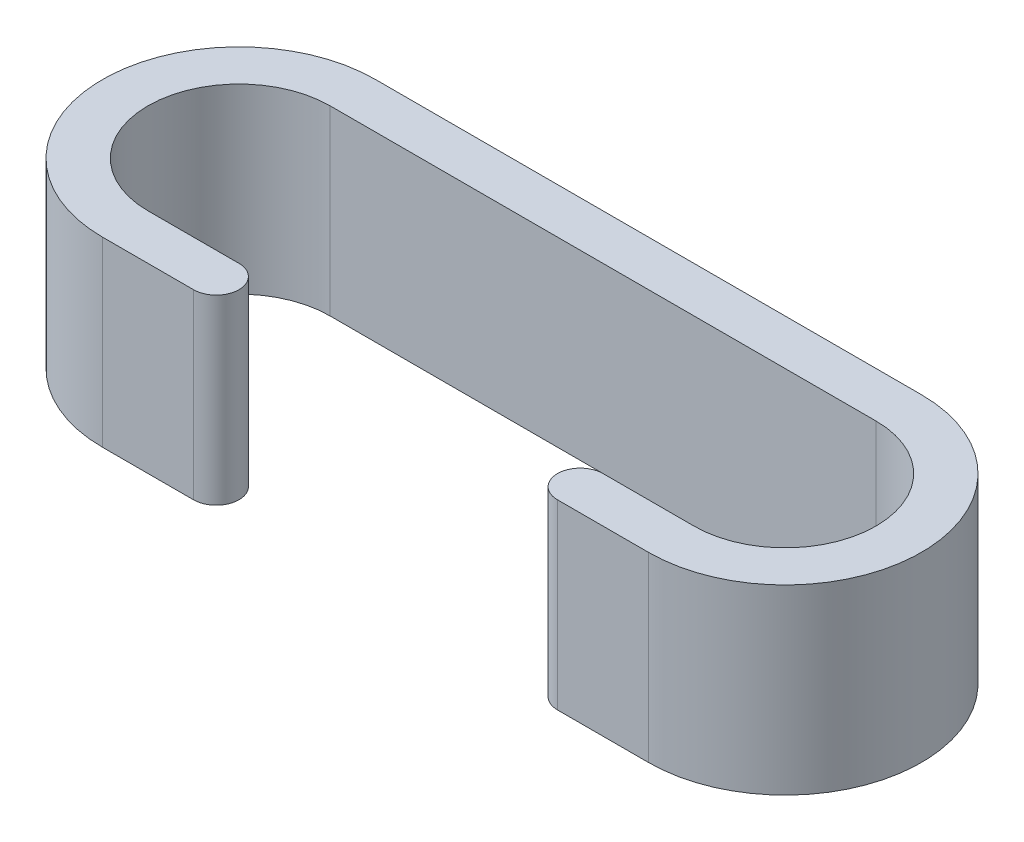
ISO-10303-21;
HEADER;
FILE_DESCRIPTION(('STEP AP214'),'2;1');
FILE_NAME('part.step','',(''),(''),'','','');
FILE_SCHEMA(('AUTOMOTIVE_DESIGN { 1 0 10303 214 1 1 1 1 }'));
ENDSEC;
DATA;
#1=APPLICATION_CONTEXT('core data for automotive mechanical design processes');
#2=APPLICATION_PROTOCOL_DEFINITION('international standard','automotive_design',2000,#1);
#3=PRODUCT_CONTEXT('',#1,'mechanical');
#4=PRODUCT('Part','Part','',(#3));
#5=PRODUCT_RELATED_PRODUCT_CATEGORY('part','',(#4));
#6=PRODUCT_DEFINITION_FORMATION('','',#4);
#7=PRODUCT_DEFINITION_CONTEXT('part definition',#1,'design');
#8=PRODUCT_DEFINITION('design','',#6,#7);
#9=PRODUCT_DEFINITION_SHAPE('','',#8);
#10=(LENGTH_UNIT() NAMED_UNIT(*) SI_UNIT(.MILLI.,.METRE.));
#11=(NAMED_UNIT(*) PLANE_ANGLE_UNIT() SI_UNIT($,.RADIAN.));
#12=(NAMED_UNIT(*) SI_UNIT($,.STERADIAN.) SOLID_ANGLE_UNIT());
#13=UNCERTAINTY_MEASURE_WITH_UNIT(LENGTH_MEASURE(1.E-05),#10,'distance_accuracy_value','');
#14=(GEOMETRIC_REPRESENTATION_CONTEXT(3) GLOBAL_UNCERTAINTY_ASSIGNED_CONTEXT((#13)) GLOBAL_UNIT_ASSIGNED_CONTEXT((#10,
#11,#12)) REPRESENTATION_CONTEXT('',''));
#15=CARTESIAN_POINT('',(0.,0.,0.));
#16=DIRECTION('',(0.,0.,1.));
#17=DIRECTION('',(1.,0.,0.));
#18=AXIS2_PLACEMENT_3D('',#15,#16,#17);
#19=CARTESIAN_POINT('',(-6.35,6.35,0.79375));
#20=DIRECTION('',(0.,-1.,0.));
#21=DIRECTION('',(0.,0.,-1.));
#22=AXIS2_PLACEMENT_3D('',#19,#20,#21);
#23=CYLINDRICAL_SURFACE('',#22,0.79375);
#24=CARTESIAN_POINT('',(-6.35,0.,0.79375));
#25=DIRECTION('',(0.,1.,0.));
#26=DIRECTION('',(0.,0.,-1.));
#27=AXIS2_PLACEMENT_3D('',#24,#25,#26);
#28=CIRCLE('',#27,0.79375);
#29=CARTESIAN_POINT('',(-6.35,0.,1.5875));
#30=VERTEX_POINT('',#29);
#31=CARTESIAN_POINT('',(-6.35,0.,0.));
#32=VERTEX_POINT('',#31);
#33=EDGE_CURVE('E153',#30,#32,#28,.T.);
#34=ORIENTED_EDGE('',*,*,#33,.T.);
#35=DIRECTION('',(0.,-1.,0.));
#36=VECTOR('',#35,1.);
#37=CARTESIAN_POINT('',(-6.35,6.35,0.));
#38=LINE('',#37,#36);
#39=CARTESIAN_POINT('',(-6.35,6.35,0.));
#40=VERTEX_POINT('',#39);
#41=EDGE_CURVE('E11',#40,#32,#38,.T.);
#42=ORIENTED_EDGE('',*,*,#41,.F.);
#43=CARTESIAN_POINT('',(-6.35,6.35,0.79375));
#44=DIRECTION('',(0.,1.,0.));
#45=DIRECTION('',(0.,0.,-1.));
#46=AXIS2_PLACEMENT_3D('',#43,#44,#45);
#47=CIRCLE('',#46,0.79375);
#48=CARTESIAN_POINT('',(-6.35,6.35,1.5875));
#49=VERTEX_POINT('',#48);
#50=EDGE_CURVE('E175',#49,#40,#47,.T.);
#51=ORIENTED_EDGE('',*,*,#50,.F.);
#52=DIRECTION('',(0.,-1.,0.));
#53=VECTOR('',#52,1.);
#54=CARTESIAN_POINT('',(-6.35,6.35,1.5875));
#55=LINE('',#54,#53);
#56=EDGE_CURVE('E149',#49,#30,#55,.T.);
#57=ORIENTED_EDGE('',*,*,#56,.T.);
#58=EDGE_LOOP('',(#34,#42,#51,#57));
#59=FACE_BOUND('',#58,.T.);
#60=ADVANCED_FACE('F33',(#59),#23,.T.);
#61=CARTESIAN_POINT('',(-6.35,6.35,0.));
#62=DIRECTION('',(0.,0.,1.));
#63=DIRECTION('',(1.,0.,0.));
#64=AXIS2_PLACEMENT_3D('',#61,#62,#63);
#65=PLANE('',#64);
#66=DIRECTION('',(-1.,0.,0.));
#67=VECTOR('',#66,1.);
#68=CARTESIAN_POINT('',(-6.35,0.,0.));
#69=LINE('',#68,#67);
#70=CARTESIAN_POINT('',(-9.525,0.,0.));
#71=VERTEX_POINT('',#70);
#72=EDGE_CURVE('E156',#32,#71,#69,.T.);
#73=ORIENTED_EDGE('',*,*,#72,.T.);
#74=DIRECTION('',(0.,-1.,0.));
#75=VECTOR('',#74,1.);
#76=CARTESIAN_POINT('',(-9.525,6.35,0.));
#77=LINE('',#76,#75);
#78=CARTESIAN_POINT('',(-9.525,6.35,0.));
#79=VERTEX_POINT('',#78);
#80=EDGE_CURVE('E41',#79,#71,#77,.T.);
#81=ORIENTED_EDGE('',*,*,#80,.F.);
#82=DIRECTION('',(-1.,0.,0.));
#83=VECTOR('',#82,1.);
#84=CARTESIAN_POINT('',(-6.35,6.35,0.));
#85=LINE('',#84,#83);
#86=EDGE_CURVE('E104',#40,#79,#85,.T.);
#87=ORIENTED_EDGE('',*,*,#86,.F.);
#88=ORIENTED_EDGE('',*,*,#41,.T.);
#89=EDGE_LOOP('',(#73,#81,#87,#88));
#90=FACE_BOUND('',#89,.T.);
#91=ADVANCED_FACE('F253',(#90),#65,.F.);
#92=CARTESIAN_POINT('',(-9.525,6.35,-3.175));
#93=DIRECTION('',(0.,-1.,0.));
#94=DIRECTION('',(0.,0.,-1.));
#95=AXIS2_PLACEMENT_3D('',#92,#93,#94);
#96=CYLINDRICAL_SURFACE('',#95,3.175);
#97=CARTESIAN_POINT('',(-9.525,0.,-3.175));
#98=DIRECTION('',(0.,-1.,0.));
#99=DIRECTION('',(0.,0.,-1.));
#100=AXIS2_PLACEMENT_3D('',#97,#98,#99);
#101=CIRCLE('',#100,3.175);
#102=CARTESIAN_POINT('',(-9.525,0.,-6.35));
#103=VERTEX_POINT('',#102);
#104=EDGE_CURVE('E158',#71,#103,#101,.T.);
#105=ORIENTED_EDGE('',*,*,#104,.T.);
#106=DIRECTION('',(0.,-1.,0.));
#107=VECTOR('',#106,1.);
#108=CARTESIAN_POINT('',(-9.525,6.35,-6.35));
#109=LINE('',#108,#107);
#110=CARTESIAN_POINT('',(-9.525,6.35,-6.35));
#111=VERTEX_POINT('',#110);
#112=EDGE_CURVE('E194',#111,#103,#109,.T.);
#113=ORIENTED_EDGE('',*,*,#112,.F.);
#114=CARTESIAN_POINT('',(-9.525,6.35,-3.175));
#115=DIRECTION('',(0.,-1.,0.));
#116=DIRECTION('',(0.,0.,-1.));
#117=AXIS2_PLACEMENT_3D('',#114,#115,#116);
#118=CIRCLE('',#117,3.175);
#119=EDGE_CURVE('E202',#79,#111,#118,.T.);
#120=ORIENTED_EDGE('',*,*,#119,.F.);
#121=ORIENTED_EDGE('',*,*,#80,.T.);
#122=EDGE_LOOP('',(#105,#113,#120,#121));
#123=FACE_BOUND('',#122,.T.);
#124=ADVANCED_FACE('F200',(#123),#96,.F.);
#125=CARTESIAN_POINT('',(-9.525,6.35,-6.35));
#126=DIRECTION('',(0.,0.,-1.));
#127=DIRECTION('',(-1.,0.,0.));
#128=AXIS2_PLACEMENT_3D('',#125,#126,#127);
#129=PLANE('',#128);
#130=DIRECTION('',(1.,0.,0.));
#131=VECTOR('',#130,1.);
#132=CARTESIAN_POINT('',(-9.525,0.,-6.35));
#133=LINE('',#132,#131);
#134=CARTESIAN_POINT('',(9.52499999999999,0.,-6.35));
#135=VERTEX_POINT('',#134);
#136=EDGE_CURVE('E160',#103,#135,#133,.T.);
#137=ORIENTED_EDGE('',*,*,#136,.T.);
#138=DIRECTION('',(0.,-1.,0.));
#139=VECTOR('',#138,1.);
#140=CARTESIAN_POINT('',(9.52499999999999,6.35,-6.35));
#141=LINE('',#140,#139);
#142=CARTESIAN_POINT('',(9.52499999999999,6.35,-6.35));
#143=VERTEX_POINT('',#142);
#144=EDGE_CURVE('E191',#143,#135,#141,.T.);
#145=ORIENTED_EDGE('',*,*,#144,.F.);
#146=DIRECTION('',(1.,0.,0.));
#147=VECTOR('',#146,1.);
#148=CARTESIAN_POINT('',(-9.525,6.35,-6.35));
#149=LINE('',#148,#147);
#150=EDGE_CURVE('E220',#111,#143,#149,.T.);
#151=ORIENTED_EDGE('',*,*,#150,.F.);
#152=ORIENTED_EDGE('',*,*,#112,.T.);
#153=EDGE_LOOP('',(#137,#145,#151,#152));
#154=FACE_BOUND('',#153,.T.);
#155=ADVANCED_FACE('F211',(#154),#129,.F.);
#156=CARTESIAN_POINT('',(9.525,6.35,-3.175));
#157=DIRECTION('',(0.,-1.,0.));
#158=DIRECTION('',(0.,0.,-1.));
#159=AXIS2_PLACEMENT_3D('',#156,#157,#158);
#160=CYLINDRICAL_SURFACE('',#159,3.175);
#161=CARTESIAN_POINT('',(9.525,0.,-3.175));
#162=DIRECTION('',(0.,-1.,0.));
#163=DIRECTION('',(0.,0.,-1.));
#164=AXIS2_PLACEMENT_3D('',#161,#162,#163);
#165=CIRCLE('',#164,3.175);
#166=CARTESIAN_POINT('',(9.525,0.,0.));
#167=VERTEX_POINT('',#166);
#168=EDGE_CURVE('E162',#135,#167,#165,.T.);
#169=ORIENTED_EDGE('',*,*,#168,.T.);
#170=DIRECTION('',(0.,-1.,0.));
#171=VECTOR('',#170,1.);
#172=CARTESIAN_POINT('',(9.525,6.35,0.));
#173=LINE('',#172,#171);
#174=CARTESIAN_POINT('',(9.525,6.35,0.));
#175=VERTEX_POINT('',#174);
#176=EDGE_CURVE('E188',#175,#167,#173,.T.);
#177=ORIENTED_EDGE('',*,*,#176,.F.);
#178=CARTESIAN_POINT('',(9.525,6.35,-3.175));
#179=DIRECTION('',(0.,-1.,0.));
#180=DIRECTION('',(0.,0.,-1.));
#181=AXIS2_PLACEMENT_3D('',#178,#179,#180);
#182=CIRCLE('',#181,3.175);
#183=EDGE_CURVE('E217',#143,#175,#182,.T.);
#184=ORIENTED_EDGE('',*,*,#183,.F.);
#185=ORIENTED_EDGE('',*,*,#144,.T.);
#186=EDGE_LOOP('',(#169,#177,#184,#185));
#187=FACE_BOUND('',#186,.T.);
#188=ADVANCED_FACE('F215',(#187),#160,.F.);
#189=CARTESIAN_POINT('',(9.525,6.35,0.));
#190=DIRECTION('',(0.,0.,1.));
#191=DIRECTION('',(1.,0.,0.));
#192=AXIS2_PLACEMENT_3D('',#189,#190,#191);
#193=PLANE('',#192);
#194=DIRECTION('',(-1.,0.,0.));
#195=VECTOR('',#194,1.);
#196=CARTESIAN_POINT('',(9.525,0.,0.));
#197=LINE('',#196,#195);
#198=CARTESIAN_POINT('',(6.35,0.,0.));
#199=VERTEX_POINT('',#198);
#200=EDGE_CURVE('E164',#167,#199,#197,.T.);
#201=ORIENTED_EDGE('',*,*,#200,.T.);
#202=DIRECTION('',(0.,-1.,0.));
#203=VECTOR('',#202,1.);
#204=CARTESIAN_POINT('',(6.35,6.35,0.));
#205=LINE('',#204,#203);
#206=CARTESIAN_POINT('',(6.35,6.35,0.));
#207=VERTEX_POINT('',#206);
#208=EDGE_CURVE('E185',#207,#199,#205,.T.);
#209=ORIENTED_EDGE('',*,*,#208,.F.);
#210=DIRECTION('',(-1.,0.,0.));
#211=VECTOR('',#210,1.);
#212=CARTESIAN_POINT('',(9.525,6.35,0.));
#213=LINE('',#212,#211);
#214=EDGE_CURVE('E219',#175,#207,#213,.T.);
#215=ORIENTED_EDGE('',*,*,#214,.F.);
#216=ORIENTED_EDGE('',*,*,#176,.T.);
#217=EDGE_LOOP('',(#201,#209,#215,#216));
#218=FACE_BOUND('',#217,.T.);
#219=ADVANCED_FACE('F266',(#218),#193,.F.);
#220=CARTESIAN_POINT('',(6.35,6.35,0.793749999999997));
#221=DIRECTION('',(0.,-1.,0.));
#222=DIRECTION('',(0.,0.,-1.));
#223=AXIS2_PLACEMENT_3D('',#220,#221,#222);
#224=CYLINDRICAL_SURFACE('',#223,0.79375);
#225=CARTESIAN_POINT('',(6.35,0.,0.793749999999997));
#226=DIRECTION('',(0.,1.,0.));
#227=DIRECTION('',(0.,0.,1.));
#228=AXIS2_PLACEMENT_3D('',#225,#226,#227);
#229=CIRCLE('',#228,0.79375);
#230=CARTESIAN_POINT('',(6.35,0.,1.5875));
#231=VERTEX_POINT('',#230);
#232=EDGE_CURVE('E166',#199,#231,#229,.T.);
#233=ORIENTED_EDGE('',*,*,#232,.T.);
#234=DIRECTION('',(0.,-1.,0.));
#235=VECTOR('',#234,1.);
#236=CARTESIAN_POINT('',(6.35,6.35,1.5875));
#237=LINE('',#236,#235);
#238=CARTESIAN_POINT('',(6.35,6.35,1.5875));
#239=VERTEX_POINT('',#238);
#240=EDGE_CURVE('E182',#239,#231,#237,.T.);
#241=ORIENTED_EDGE('',*,*,#240,.F.);
#242=CARTESIAN_POINT('',(6.35,6.35,0.793749999999997));
#243=DIRECTION('',(0.,1.,0.));
#244=DIRECTION('',(0.,0.,1.));
#245=AXIS2_PLACEMENT_3D('',#242,#243,#244);
#246=CIRCLE('',#245,0.79375);
#247=EDGE_CURVE('E222',#207,#239,#246,.T.);
#248=ORIENTED_EDGE('',*,*,#247,.F.);
#249=ORIENTED_EDGE('',*,*,#208,.T.);
#250=EDGE_LOOP('',(#233,#241,#248,#249));
#251=FACE_BOUND('',#250,.T.);
#252=ADVANCED_FACE('F269',(#251),#224,.T.);
#253=CARTESIAN_POINT('',(9.52499999999999,6.35,1.5875));
#254=DIRECTION('',(0.,0.,-1.));
#255=DIRECTION('',(-1.,0.,0.));
#256=AXIS2_PLACEMENT_3D('',#253,#254,#255);
#257=PLANE('',#256);
#258=DIRECTION('',(1.,0.,0.));
#259=VECTOR('',#258,1.);
#260=CARTESIAN_POINT('',(9.52499999999999,0.,1.5875));
#261=LINE('',#260,#259);
#262=CARTESIAN_POINT('',(9.52499999999999,0.,1.5875));
#263=VERTEX_POINT('',#262);
#264=EDGE_CURVE('E168',#231,#263,#261,.T.);
#265=ORIENTED_EDGE('',*,*,#264,.T.);
#266=DIRECTION('',(0.,-1.,0.));
#267=VECTOR('',#266,1.);
#268=CARTESIAN_POINT('',(9.52499999999999,6.35,1.5875));
#269=LINE('',#268,#267);
#270=CARTESIAN_POINT('',(9.52499999999999,6.35,1.5875));
#271=VERTEX_POINT('',#270);
#272=EDGE_CURVE('E179',#271,#263,#269,.T.);
#273=ORIENTED_EDGE('',*,*,#272,.F.);
#274=DIRECTION('',(1.,0.,0.));
#275=VECTOR('',#274,1.);
#276=CARTESIAN_POINT('',(9.52499999999999,6.35,1.5875));
#277=LINE('',#276,#275);
#278=EDGE_CURVE('E228',#239,#271,#277,.T.);
#279=ORIENTED_EDGE('',*,*,#278,.F.);
#280=ORIENTED_EDGE('',*,*,#240,.T.);
#281=EDGE_LOOP('',(#265,#273,#279,#280));
#282=FACE_BOUND('',#281,.T.);
#283=ADVANCED_FACE('F234',(#282),#257,.F.);
#284=CARTESIAN_POINT('',(9.525,6.35,-3.175));
#285=DIRECTION('',(0.,-1.,0.));
#286=DIRECTION('',(0.,0.,-1.));
#287=AXIS2_PLACEMENT_3D('',#284,#285,#286);
#288=CYLINDRICAL_SURFACE('',#287,4.7625);
#289=CARTESIAN_POINT('',(9.525,0.,-3.175));
#290=DIRECTION('',(0.,1.,0.));
#291=DIRECTION('',(0.,0.,-1.));
#292=AXIS2_PLACEMENT_3D('',#289,#290,#291);
#293=CIRCLE('',#292,4.7625);
#294=CARTESIAN_POINT('',(9.525,0.,-7.9375));
#295=VERTEX_POINT('',#294);
#296=EDGE_CURVE('E170',#263,#295,#293,.T.);
#297=ORIENTED_EDGE('',*,*,#296,.T.);
#298=DIRECTION('',(0.,-1.,0.));
#299=VECTOR('',#298,1.);
#300=CARTESIAN_POINT('',(9.525,6.35,-7.9375));
#301=LINE('',#300,#299);
#302=CARTESIAN_POINT('',(9.525,6.35,-7.9375));
#303=VERTEX_POINT('',#302);
#304=EDGE_CURVE('E144',#303,#295,#301,.T.);
#305=ORIENTED_EDGE('',*,*,#304,.F.);
#306=CARTESIAN_POINT('',(9.525,6.35,-3.175));
#307=DIRECTION('',(0.,1.,0.));
#308=DIRECTION('',(0.,0.,-1.));
#309=AXIS2_PLACEMENT_3D('',#306,#307,#308);
#310=CIRCLE('',#309,4.7625);
#311=EDGE_CURVE('E135',#271,#303,#310,.T.);
#312=ORIENTED_EDGE('',*,*,#311,.F.);
#313=ORIENTED_EDGE('',*,*,#272,.T.);
#314=EDGE_LOOP('',(#297,#305,#312,#313));
#315=FACE_BOUND('',#314,.T.);
#316=ADVANCED_FACE('F238',(#315),#288,.T.);
#317=CARTESIAN_POINT('',(-9.525,6.35,-7.9375));
#318=DIRECTION('',(0.,0.,1.));
#319=DIRECTION('',(1.,0.,0.));
#320=AXIS2_PLACEMENT_3D('',#317,#318,#319);
#321=PLANE('',#320);
#322=DIRECTION('',(-1.,0.,0.));
#323=VECTOR('',#322,1.);
#324=CARTESIAN_POINT('',(-9.525,0.,-7.9375));
#325=LINE('',#324,#323);
#326=CARTESIAN_POINT('',(-9.525,0.,-7.9375));
#327=VERTEX_POINT('',#326);
#328=EDGE_CURVE('E143',#295,#327,#325,.T.);
#329=ORIENTED_EDGE('',*,*,#328,.T.);
#330=DIRECTION('',(0.,-1.,0.));
#331=VECTOR('',#330,1.);
#332=CARTESIAN_POINT('',(-9.525,6.35,-7.9375));
#333=LINE('',#332,#331);
#334=CARTESIAN_POINT('',(-9.525,6.35,-7.9375));
#335=VERTEX_POINT('',#334);
#336=EDGE_CURVE('E140',#335,#327,#333,.T.);
#337=ORIENTED_EDGE('',*,*,#336,.F.);
#338=DIRECTION('',(-1.,0.,0.));
#339=VECTOR('',#338,1.);
#340=CARTESIAN_POINT('',(-9.525,6.35,-7.9375));
#341=LINE('',#340,#339);
#342=EDGE_CURVE('E129',#303,#335,#341,.T.);
#343=ORIENTED_EDGE('',*,*,#342,.F.);
#344=ORIENTED_EDGE('',*,*,#304,.T.);
#345=EDGE_LOOP('',(#329,#337,#343,#344));
#346=FACE_BOUND('',#345,.T.);
#347=ADVANCED_FACE('F141',(#346),#321,.F.);
#348=CARTESIAN_POINT('',(-9.525,6.35,-3.175));
#349=DIRECTION('',(0.,-1.,0.));
#350=DIRECTION('',(0.,0.,-1.));
#351=AXIS2_PLACEMENT_3D('',#348,#349,#350);
#352=CYLINDRICAL_SURFACE('',#351,4.7625);
#353=CARTESIAN_POINT('',(-9.525,0.,-3.175));
#354=DIRECTION('',(0.,1.,0.));
#355=DIRECTION('',(0.,0.,-1.));
#356=AXIS2_PLACEMENT_3D('',#353,#354,#355);
#357=CIRCLE('',#356,4.7625);
#358=CARTESIAN_POINT('',(-9.525,0.,1.5875));
#359=VERTEX_POINT('',#358);
#360=EDGE_CURVE('E90',#327,#359,#357,.T.);
#361=ORIENTED_EDGE('',*,*,#360,.T.);
#362=DIRECTION('',(0.,-1.,0.));
#363=VECTOR('',#362,1.);
#364=CARTESIAN_POINT('',(-9.525,6.35,1.5875));
#365=LINE('',#364,#363);
#366=CARTESIAN_POINT('',(-9.525,6.35,1.5875));
#367=VERTEX_POINT('',#366);
#368=EDGE_CURVE('E145',#367,#359,#365,.T.);
#369=ORIENTED_EDGE('',*,*,#368,.F.);
#370=CARTESIAN_POINT('',(-9.525,6.35,-3.175));
#371=DIRECTION('',(0.,1.,0.));
#372=DIRECTION('',(0.,0.,-1.));
#373=AXIS2_PLACEMENT_3D('',#370,#371,#372);
#374=CIRCLE('',#373,4.7625);
#375=EDGE_CURVE('E133',#335,#367,#374,.T.);
#376=ORIENTED_EDGE('',*,*,#375,.F.);
#377=ORIENTED_EDGE('',*,*,#336,.T.);
#378=EDGE_LOOP('',(#361,#369,#376,#377));
#379=FACE_BOUND('',#378,.T.);
#380=ADVANCED_FACE('F147',(#379),#352,.T.);
#381=CARTESIAN_POINT('',(-6.35,6.35,1.5875));
#382=DIRECTION('',(0.,0.,-1.));
#383=DIRECTION('',(-1.,0.,0.));
#384=AXIS2_PLACEMENT_3D('',#381,#382,#383);
#385=PLANE('',#384);
#386=DIRECTION('',(1.,0.,0.));
#387=VECTOR('',#386,1.);
#388=CARTESIAN_POINT('',(-6.35,0.,1.5875));
#389=LINE('',#388,#387);
#390=EDGE_CURVE('E96',#359,#30,#389,.T.);
#391=ORIENTED_EDGE('',*,*,#390,.T.);
#392=ORIENTED_EDGE('',*,*,#56,.F.);
#393=DIRECTION('',(1.,0.,0.));
#394=VECTOR('',#393,1.);
#395=CARTESIAN_POINT('',(-6.35,6.35,1.5875));
#396=LINE('',#395,#394);
#397=EDGE_CURVE('E49',#367,#49,#396,.T.);
#398=ORIENTED_EDGE('',*,*,#397,.F.);
#399=ORIENTED_EDGE('',*,*,#368,.T.);
#400=EDGE_LOOP('',(#391,#392,#398,#399));
#401=FACE_BOUND('',#400,.T.);
#402=ADVANCED_FACE('F242',(#401),#385,.F.);
#403=CARTESIAN_POINT('',(-6.35,6.35,0.79375));
#404=DIRECTION('',(0.,-1.,0.));
#405=DIRECTION('',(0.,0.,-1.));
#406=AXIS2_PLACEMENT_3D('',#403,#404,#405);
#407=PLANE('',#406);
#408=ORIENTED_EDGE('',*,*,#50,.T.);
#409=ORIENTED_EDGE('',*,*,#86,.T.);
#410=ORIENTED_EDGE('',*,*,#119,.T.);
#411=ORIENTED_EDGE('',*,*,#150,.T.);
#412=ORIENTED_EDGE('',*,*,#183,.T.);
#413=ORIENTED_EDGE('',*,*,#214,.T.);
#414=ORIENTED_EDGE('',*,*,#247,.T.);
#415=ORIENTED_EDGE('',*,*,#278,.T.);
#416=ORIENTED_EDGE('',*,*,#311,.T.);
#417=ORIENTED_EDGE('',*,*,#342,.T.);
#418=ORIENTED_EDGE('',*,*,#375,.T.);
#419=ORIENTED_EDGE('',*,*,#397,.T.);
#420=EDGE_LOOP('',(#408,#409,#410,#411,#412,#413,#414,#415,#416,#417,#418,#419));
#421=FACE_BOUND('',#420,.T.);
#422=ADVANCED_FACE('F131',(#421),#407,.F.);
#423=CARTESIAN_POINT('',(-6.35,0.,0.79375));
#424=DIRECTION('',(0.,-1.,0.));
#425=DIRECTION('',(0.,0.,-1.));
#426=AXIS2_PLACEMENT_3D('',#423,#424,#425);
#427=PLANE('',#426);
#428=ORIENTED_EDGE('',*,*,#33,.F.);
#429=ORIENTED_EDGE('',*,*,#390,.F.);
#430=ORIENTED_EDGE('',*,*,#360,.F.);
#431=ORIENTED_EDGE('',*,*,#328,.F.);
#432=ORIENTED_EDGE('',*,*,#296,.F.);
#433=ORIENTED_EDGE('',*,*,#264,.F.);
#434=ORIENTED_EDGE('',*,*,#232,.F.);
#435=ORIENTED_EDGE('',*,*,#200,.F.);
#436=ORIENTED_EDGE('',*,*,#168,.F.);
#437=ORIENTED_EDGE('',*,*,#136,.F.);
#438=ORIENTED_EDGE('',*,*,#104,.F.);
#439=ORIENTED_EDGE('',*,*,#72,.F.);
#440=EDGE_LOOP('',(#428,#429,#430,#431,#432,#433,#434,#435,#436,#437,#438,#439));
#441=FACE_BOUND('',#440,.T.);
#442=ADVANCED_FACE('F206',(#441),#427,.T.);
#443=CLOSED_SHELL('',(#60,#91,#124,#155,#188,#219,#252,#283,#316,#347,#380,#402,#422,#442));
#444=MANIFOLD_SOLID_BREP('B2',#443);
#445=ADVANCED_BREP_SHAPE_REPRESENTATION('',(#18,#444),#14);
#446=SHAPE_DEFINITION_REPRESENTATION(#9,#445);
ENDSEC;
END-ISO-10303-21;
